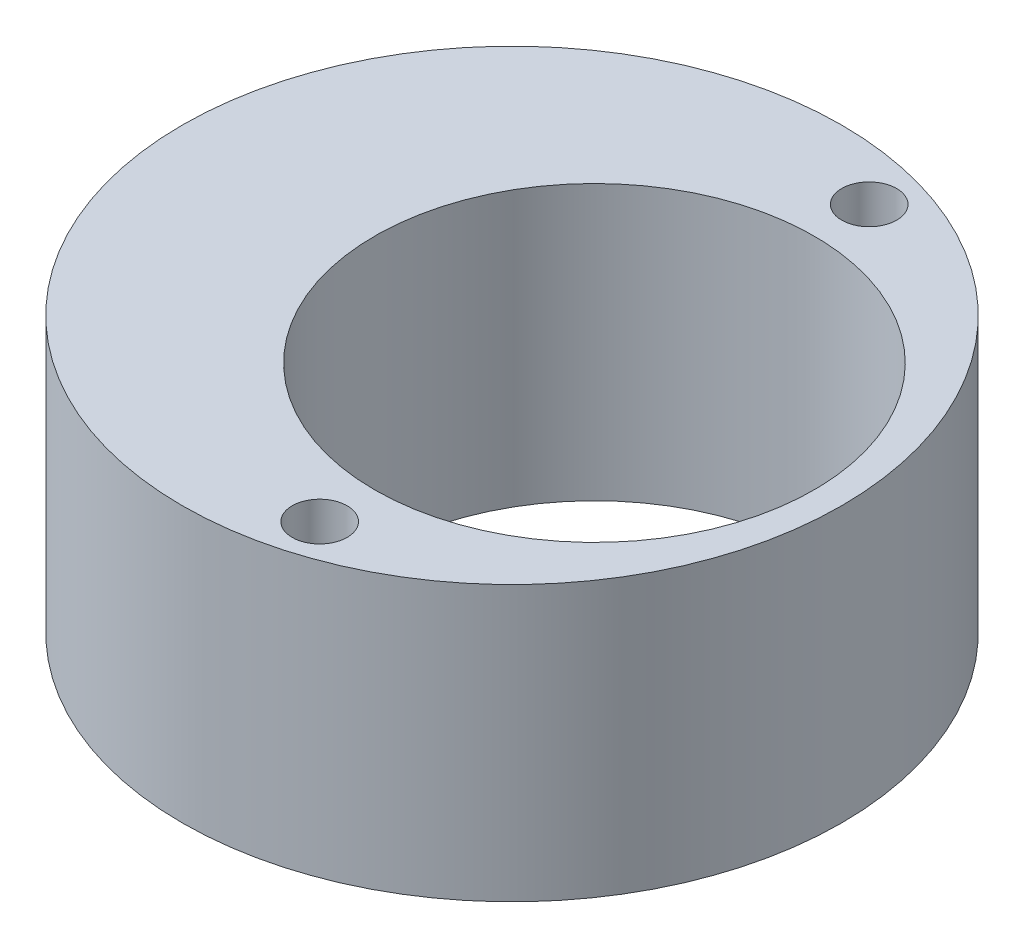
ISO-10303-21;
HEADER;
FILE_DESCRIPTION(('STEP AP214'),'2;1');
FILE_NAME('part.step','',(''),(''),'','','');
FILE_SCHEMA(('AUTOMOTIVE_DESIGN { 1 0 10303 214 1 1 1 1 }'));
ENDSEC;
DATA;
#1=APPLICATION_CONTEXT('core data for automotive mechanical design processes');
#2=APPLICATION_PROTOCOL_DEFINITION('international standard','automotive_design',2000,#1);
#3=PRODUCT_CONTEXT('',#1,'mechanical');
#4=PRODUCT('Part','Part','',(#3));
#5=PRODUCT_RELATED_PRODUCT_CATEGORY('part','',(#4));
#6=PRODUCT_DEFINITION_FORMATION('','',#4);
#7=PRODUCT_DEFINITION_CONTEXT('part definition',#1,'design');
#8=PRODUCT_DEFINITION('design','',#6,#7);
#9=PRODUCT_DEFINITION_SHAPE('','',#8);
#10=(LENGTH_UNIT() NAMED_UNIT(*) SI_UNIT(.MILLI.,.METRE.));
#11=(NAMED_UNIT(*) PLANE_ANGLE_UNIT() SI_UNIT($,.RADIAN.));
#12=(NAMED_UNIT(*) SI_UNIT($,.STERADIAN.) SOLID_ANGLE_UNIT());
#13=UNCERTAINTY_MEASURE_WITH_UNIT(LENGTH_MEASURE(1.E-05),#10,'distance_accuracy_value','');
#14=(GEOMETRIC_REPRESENTATION_CONTEXT(3) GLOBAL_UNCERTAINTY_ASSIGNED_CONTEXT((#13)) GLOBAL_UNIT_ASSIGNED_CONTEXT((#10,
#11,#12)) REPRESENTATION_CONTEXT('',''));
#15=CARTESIAN_POINT('',(0.,0.,0.));
#16=DIRECTION('',(0.,0.,1.));
#17=DIRECTION('',(1.,0.,0.));
#18=AXIS2_PLACEMENT_3D('',#15,#16,#17);
#19=CARTESIAN_POINT('',(-1.5,5.,0.));
#20=DIRECTION('',(0.,1.,0.));
#21=DIRECTION('',(0.,0.,1.));
#22=AXIS2_PLACEMENT_3D('',#19,#20,#21);
#23=PLANE('',#22);
#24=CARTESIAN_POINT('',(0.,5.,-5.));
#25=DIRECTION('',(0.,1.,0.));
#26=DIRECTION('',(0.,0.,1.));
#27=AXIS2_PLACEMENT_3D('',#24,#25,#26);
#28=CIRCLE('',#27,0.5);
#29=CARTESIAN_POINT('',(0.,5.,-4.5));
#30=VERTEX_POINT('',#29);
#31=EDGE_CURVE('E47',#30,#30,#28,.T.);
#32=ORIENTED_EDGE('',*,*,#31,.F.);
#33=EDGE_LOOP('',(#32));
#34=FACE_BOUND('',#33,.T.);
#35=CARTESIAN_POINT('',(-1.5,5.,0.));
#36=DIRECTION('',(0.,1.,0.));
#37=DIRECTION('',(0.,0.,1.));
#38=AXIS2_PLACEMENT_3D('',#35,#36,#37);
#39=CIRCLE('',#38,6.);
#40=CARTESIAN_POINT('',(-1.5,5.,6.));
#41=VERTEX_POINT('',#40);
#42=EDGE_CURVE('E10',#41,#41,#39,.T.);
#43=ORIENTED_EDGE('',*,*,#42,.T.);
#44=EDGE_LOOP('',(#43));
#45=FACE_BOUND('',#44,.T.);
#46=CARTESIAN_POINT('',(0.,5.,0.));
#47=DIRECTION('',(0.,1.,0.));
#48=DIRECTION('',(0.,0.,1.));
#49=AXIS2_PLACEMENT_3D('',#46,#47,#48);
#50=CIRCLE('',#49,4.);
#51=CARTESIAN_POINT('',(0.,5.,4.));
#52=VERTEX_POINT('',#51);
#53=EDGE_CURVE('E42',#52,#52,#50,.T.);
#54=ORIENTED_EDGE('',*,*,#53,.F.);
#55=EDGE_LOOP('',(#54));
#56=FACE_BOUND('',#55,.T.);
#57=CARTESIAN_POINT('',(0.,5.,5.));
#58=DIRECTION('',(0.,1.,0.));
#59=DIRECTION('',(0.,0.,1.));
#60=AXIS2_PLACEMENT_3D('',#57,#58,#59);
#61=CIRCLE('',#60,0.5);
#62=CARTESIAN_POINT('',(0.,5.,5.5));
#63=VERTEX_POINT('',#62);
#64=EDGE_CURVE('E53',#63,#63,#61,.T.);
#65=ORIENTED_EDGE('',*,*,#64,.F.);
#66=EDGE_LOOP('',(#65));
#67=FACE_BOUND('',#66,.T.);
#68=ADVANCED_FACE('F31',(#34,#45,#56,#67),#23,.T.);
#69=CARTESIAN_POINT('',(-1.5,0.,0.));
#70=DIRECTION('',(0.,1.,0.));
#71=DIRECTION('',(0.,0.,1.));
#72=AXIS2_PLACEMENT_3D('',#69,#70,#71);
#73=PLANE('',#72);
#74=CARTESIAN_POINT('',(-1.5,0.,0.));
#75=DIRECTION('',(0.,1.,0.));
#76=DIRECTION('',(0.,0.,1.));
#77=AXIS2_PLACEMENT_3D('',#74,#75,#76);
#78=CIRCLE('',#77,6.);
#79=CARTESIAN_POINT('',(-1.5,0.,6.));
#80=VERTEX_POINT('',#79);
#81=EDGE_CURVE('E35',#80,#80,#78,.T.);
#82=ORIENTED_EDGE('',*,*,#81,.F.);
#83=EDGE_LOOP('',(#82));
#84=FACE_BOUND('',#83,.T.);
#85=CARTESIAN_POINT('',(0.,0.,0.));
#86=DIRECTION('',(0.,1.,0.));
#87=DIRECTION('',(0.,0.,1.));
#88=AXIS2_PLACEMENT_3D('',#85,#86,#87);
#89=CIRCLE('',#88,4.);
#90=CARTESIAN_POINT('',(0.,0.,4.));
#91=VERTEX_POINT('',#90);
#92=EDGE_CURVE('E44',#91,#91,#89,.T.);
#93=ORIENTED_EDGE('',*,*,#92,.T.);
#94=EDGE_LOOP('',(#93));
#95=FACE_BOUND('',#94,.T.);
#96=CARTESIAN_POINT('',(0.,0.,-5.));
#97=DIRECTION('',(0.,1.,0.));
#98=DIRECTION('',(0.,0.,1.));
#99=AXIS2_PLACEMENT_3D('',#96,#97,#98);
#100=CIRCLE('',#99,0.5);
#101=CARTESIAN_POINT('',(0.,0.,-4.5));
#102=VERTEX_POINT('',#101);
#103=EDGE_CURVE('E50',#102,#102,#100,.T.);
#104=ORIENTED_EDGE('',*,*,#103,.T.);
#105=EDGE_LOOP('',(#104));
#106=FACE_BOUND('',#105,.T.);
#107=CARTESIAN_POINT('',(0.,0.,5.));
#108=DIRECTION('',(0.,1.,0.));
#109=DIRECTION('',(0.,0.,1.));
#110=AXIS2_PLACEMENT_3D('',#107,#108,#109);
#111=CIRCLE('',#110,0.5);
#112=CARTESIAN_POINT('',(0.,0.,5.5));
#113=VERTEX_POINT('',#112);
#114=EDGE_CURVE('E56',#113,#113,#111,.T.);
#115=ORIENTED_EDGE('',*,*,#114,.T.);
#116=EDGE_LOOP('',(#115));
#117=FACE_BOUND('',#116,.T.);
#118=ADVANCED_FACE('F66',(#84,#95,#106,#117),#73,.F.);
#119=CARTESIAN_POINT('',(-1.5,5.,0.));
#120=DIRECTION('',(0.,-1.,0.));
#121=DIRECTION('',(0.,0.,-1.));
#122=AXIS2_PLACEMENT_3D('',#119,#120,#121);
#123=CYLINDRICAL_SURFACE('',#122,6.);
#124=ORIENTED_EDGE('',*,*,#42,.F.);
#125=EDGE_LOOP('',(#124));
#126=FACE_BOUND('',#125,.T.);
#127=ORIENTED_EDGE('',*,*,#81,.T.);
#128=EDGE_LOOP('',(#127));
#129=FACE_BOUND('',#128,.T.);
#130=ADVANCED_FACE('F33',(#126,#129),#123,.T.);
#131=CARTESIAN_POINT('',(0.,5.,0.));
#132=DIRECTION('',(0.,-1.,0.));
#133=DIRECTION('',(0.,0.,-1.));
#134=AXIS2_PLACEMENT_3D('',#131,#132,#133);
#135=CYLINDRICAL_SURFACE('',#134,4.);
#136=ORIENTED_EDGE('',*,*,#53,.T.);
#137=EDGE_LOOP('',(#136));
#138=FACE_BOUND('',#137,.T.);
#139=ORIENTED_EDGE('',*,*,#92,.F.);
#140=EDGE_LOOP('',(#139));
#141=FACE_BOUND('',#140,.T.);
#142=ADVANCED_FACE('F75',(#138,#141),#135,.F.);
#143=CARTESIAN_POINT('',(0.,5.,-5.));
#144=DIRECTION('',(0.,-1.,0.));
#145=DIRECTION('',(0.,0.,-1.));
#146=AXIS2_PLACEMENT_3D('',#143,#144,#145);
#147=CYLINDRICAL_SURFACE('',#146,0.5);
#148=ORIENTED_EDGE('',*,*,#31,.T.);
#149=EDGE_LOOP('',(#148));
#150=FACE_BOUND('',#149,.T.);
#151=ORIENTED_EDGE('',*,*,#103,.F.);
#152=EDGE_LOOP('',(#151));
#153=FACE_BOUND('',#152,.T.);
#154=ADVANCED_FACE('F78',(#150,#153),#147,.F.);
#155=CARTESIAN_POINT('',(0.,5.,5.));
#156=DIRECTION('',(0.,-1.,0.));
#157=DIRECTION('',(0.,0.,-1.));
#158=AXIS2_PLACEMENT_3D('',#155,#156,#157);
#159=CYLINDRICAL_SURFACE('',#158,0.5);
#160=ORIENTED_EDGE('',*,*,#64,.T.);
#161=EDGE_LOOP('',(#160));
#162=FACE_BOUND('',#161,.T.);
#163=ORIENTED_EDGE('',*,*,#114,.F.);
#164=EDGE_LOOP('',(#163));
#165=FACE_BOUND('',#164,.T.);
#166=ADVANCED_FACE('F62',(#162,#165),#159,.F.);
#167=CLOSED_SHELL('',(#68,#118,#130,#142,#154,#166));
#168=MANIFOLD_SOLID_BREP('B2',#167);
#169=ADVANCED_BREP_SHAPE_REPRESENTATION('',(#18,#168),#14);
#170=SHAPE_DEFINITION_REPRESENTATION(#9,#169);
ENDSEC;
END-ISO-10303-21;
